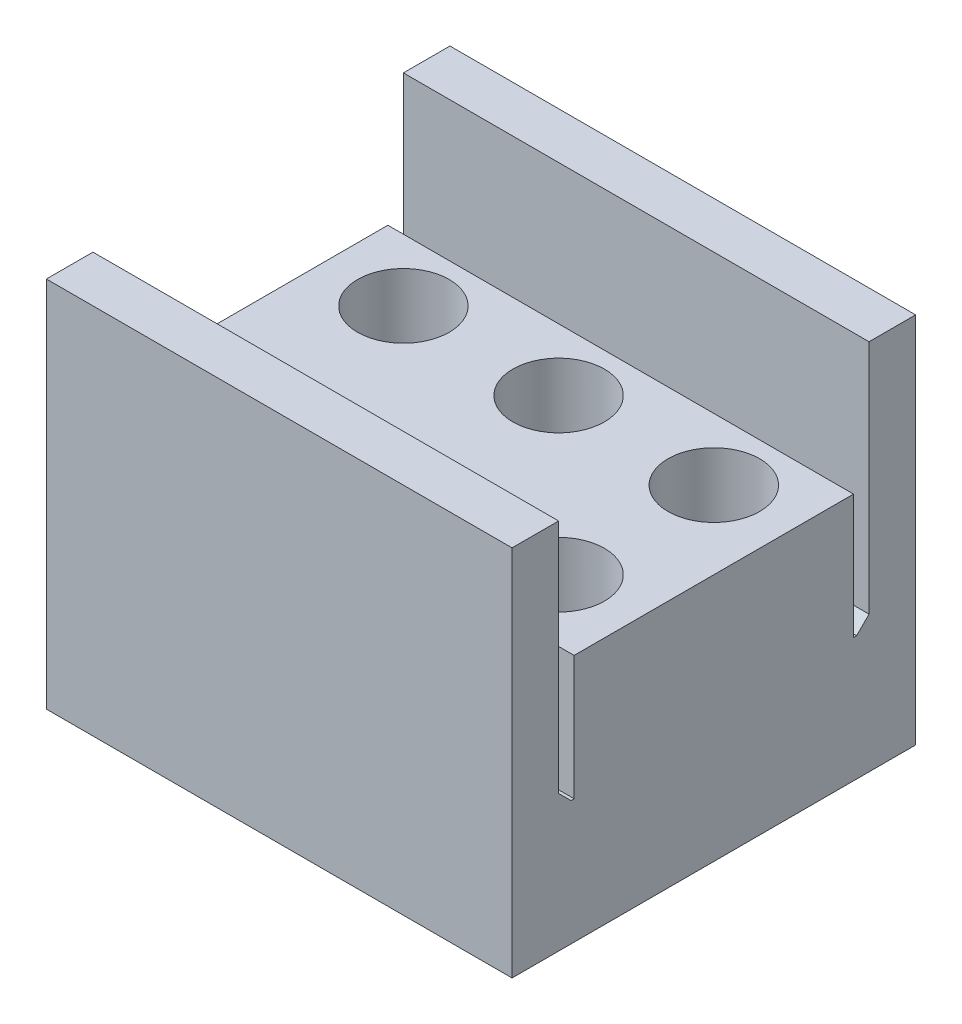
ISO-10303-21;
HEADER;
FILE_DESCRIPTION(('STEP AP214'),'2;1');
FILE_NAME('part.step','',(''),(''),'','','');
FILE_SCHEMA(('AUTOMOTIVE_DESIGN { 1 0 10303 214 1 1 1 1 }'));
ENDSEC;
DATA;
#1=APPLICATION_CONTEXT('core data for automotive mechanical design processes');
#2=APPLICATION_PROTOCOL_DEFINITION('international standard','automotive_design',2000,#1);
#3=PRODUCT_CONTEXT('',#1,'mechanical');
#4=PRODUCT('Part','Part','',(#3));
#5=PRODUCT_RELATED_PRODUCT_CATEGORY('part','',(#4));
#6=PRODUCT_DEFINITION_FORMATION('','',#4);
#7=PRODUCT_DEFINITION_CONTEXT('part definition',#1,'design');
#8=PRODUCT_DEFINITION('design','',#6,#7);
#9=PRODUCT_DEFINITION_SHAPE('','',#8);
#10=(LENGTH_UNIT() NAMED_UNIT(*) SI_UNIT(.MILLI.,.METRE.));
#11=(NAMED_UNIT(*) PLANE_ANGLE_UNIT() SI_UNIT($,.RADIAN.));
#12=(NAMED_UNIT(*) SI_UNIT($,.STERADIAN.) SOLID_ANGLE_UNIT());
#13=UNCERTAINTY_MEASURE_WITH_UNIT(LENGTH_MEASURE(1.E-05),#10,'distance_accuracy_value','');
#14=(GEOMETRIC_REPRESENTATION_CONTEXT(3) GLOBAL_UNCERTAINTY_ASSIGNED_CONTEXT((#13)) GLOBAL_UNIT_ASSIGNED_CONTEXT((#10,
#11,#12)) REPRESENTATION_CONTEXT('',''));
#15=CARTESIAN_POINT('',(0.,0.,0.));
#16=DIRECTION('',(0.,0.,1.));
#17=DIRECTION('',(1.,0.,0.));
#18=AXIS2_PLACEMENT_3D('',#15,#16,#17);
#19=CARTESIAN_POINT('',(5.,12.1719300090006,-2.5));
#20=DIRECTION('',(0.,-1.,0.));
#21=DIRECTION('',(0.,0.,-1.));
#22=AXIS2_PLACEMENT_3D('',#19,#20,#21);
#23=CYLINDRICAL_SURFACE('',#22,1.475);
#24=CARTESIAN_POINT('',(5.,0.,-2.5));
#25=DIRECTION('',(0.,-1.,0.));
#26=DIRECTION('',(0.,0.,-1.));
#27=AXIS2_PLACEMENT_3D('',#24,#25,#26);
#28=CIRCLE('',#27,1.475);
#29=CARTESIAN_POINT('',(5.,0.,-3.975));
#30=VERTEX_POINT('',#29);
#31=EDGE_CURVE('E49',#30,#30,#28,.T.);
#32=ORIENTED_EDGE('',*,*,#31,.T.);
#33=EDGE_LOOP('',(#32));
#34=FACE_BOUND('',#33,.T.);
#35=CARTESIAN_POINT('',(5.,8.,-2.5));
#36=DIRECTION('',(0.,1.,0.));
#37=DIRECTION('',(0.,0.,1.));
#38=AXIS2_PLACEMENT_3D('',#35,#36,#37);
#39=CIRCLE('',#38,1.475);
#40=CARTESIAN_POINT('',(5.,8.,-1.025));
#41=VERTEX_POINT('',#40);
#42=EDGE_CURVE('E11',#41,#41,#39,.F.);
#43=ORIENTED_EDGE('',*,*,#42,.F.);
#44=EDGE_LOOP('',(#43));
#45=FACE_BOUND('',#44,.T.);
#46=ADVANCED_FACE('F43',(#34,#45),#23,.F.);
#47=CARTESIAN_POINT('',(0.,12.1719300090006,-2.5));
#48=DIRECTION('',(0.,-1.,0.));
#49=DIRECTION('',(0.,0.,-1.));
#50=AXIS2_PLACEMENT_3D('',#47,#48,#49);
#51=CYLINDRICAL_SURFACE('',#50,1.475);
#52=CARTESIAN_POINT('',(0.,0.,-2.5));
#53=DIRECTION('',(0.,-1.,0.));
#54=DIRECTION('',(0.,0.,-1.));
#55=AXIS2_PLACEMENT_3D('',#52,#53,#54);
#56=CIRCLE('',#55,1.475);
#57=CARTESIAN_POINT('',(0.,0.,-3.975));
#58=VERTEX_POINT('',#57);
#59=EDGE_CURVE('E266',#58,#58,#56,.T.);
#60=ORIENTED_EDGE('',*,*,#59,.T.);
#61=EDGE_LOOP('',(#60));
#62=FACE_BOUND('',#61,.T.);
#63=CARTESIAN_POINT('',(0.,8.,-2.5));
#64=DIRECTION('',(0.,1.,0.));
#65=DIRECTION('',(0.,0.,1.));
#66=AXIS2_PLACEMENT_3D('',#63,#64,#65);
#67=CIRCLE('',#66,1.475);
#68=CARTESIAN_POINT('',(0.,8.,-1.025));
#69=VERTEX_POINT('',#68);
#70=EDGE_CURVE('E271',#69,#69,#67,.F.);
#71=ORIENTED_EDGE('',*,*,#70,.F.);
#72=EDGE_LOOP('',(#71));
#73=FACE_BOUND('',#72,.T.);
#74=ADVANCED_FACE('F301',(#62,#73),#51,.F.);
#75=CARTESIAN_POINT('',(-5.,12.1719300090006,-2.5));
#76=DIRECTION('',(0.,-1.,0.));
#77=DIRECTION('',(0.,0.,-1.));
#78=AXIS2_PLACEMENT_3D('',#75,#76,#77);
#79=CYLINDRICAL_SURFACE('',#78,1.475);
#80=CARTESIAN_POINT('',(-5.,0.,-2.5));
#81=DIRECTION('',(0.,-1.,0.));
#82=DIRECTION('',(0.,0.,-1.));
#83=AXIS2_PLACEMENT_3D('',#80,#81,#82);
#84=CIRCLE('',#83,1.475);
#85=CARTESIAN_POINT('',(-5.,0.,-3.975));
#86=VERTEX_POINT('',#85);
#87=EDGE_CURVE('E263',#86,#86,#84,.T.);
#88=ORIENTED_EDGE('',*,*,#87,.T.);
#89=EDGE_LOOP('',(#88));
#90=FACE_BOUND('',#89,.T.);
#91=CARTESIAN_POINT('',(-5.,8.,-2.5));
#92=DIRECTION('',(0.,1.,0.));
#93=DIRECTION('',(0.,0.,1.));
#94=AXIS2_PLACEMENT_3D('',#91,#92,#93);
#95=CIRCLE('',#94,1.475);
#96=CARTESIAN_POINT('',(-5.,8.,-1.025));
#97=VERTEX_POINT('',#96);
#98=EDGE_CURVE('E269',#97,#97,#95,.F.);
#99=ORIENTED_EDGE('',*,*,#98,.F.);
#100=EDGE_LOOP('',(#99));
#101=FACE_BOUND('',#100,.T.);
#102=ADVANCED_FACE('F306',(#90,#101),#79,.F.);
#103=CARTESIAN_POINT('',(5.,12.1719300090006,2.5));
#104=DIRECTION('',(0.,-1.,0.));
#105=DIRECTION('',(0.,0.,-1.));
#106=AXIS2_PLACEMENT_3D('',#103,#104,#105);
#107=CYLINDRICAL_SURFACE('',#106,1.475);
#108=CARTESIAN_POINT('',(5.,0.,2.5));
#109=DIRECTION('',(0.,-1.,0.));
#110=DIRECTION('',(0.,0.,-1.));
#111=AXIS2_PLACEMENT_3D('',#108,#109,#110);
#112=CIRCLE('',#111,1.475);
#113=CARTESIAN_POINT('',(5.,0.,1.025));
#114=VERTEX_POINT('',#113);
#115=EDGE_CURVE('E257',#114,#114,#112,.T.);
#116=ORIENTED_EDGE('',*,*,#115,.T.);
#117=EDGE_LOOP('',(#116));
#118=FACE_BOUND('',#117,.T.);
#119=CARTESIAN_POINT('',(5.,8.,2.5));
#120=DIRECTION('',(0.,1.,0.));
#121=DIRECTION('',(0.,0.,1.));
#122=AXIS2_PLACEMENT_3D('',#119,#120,#121);
#123=CIRCLE('',#122,1.475);
#124=CARTESIAN_POINT('',(5.,8.,3.975));
#125=VERTEX_POINT('',#124);
#126=EDGE_CURVE('E261',#125,#125,#123,.F.);
#127=ORIENTED_EDGE('',*,*,#126,.F.);
#128=EDGE_LOOP('',(#127));
#129=FACE_BOUND('',#128,.T.);
#130=ADVANCED_FACE('F311',(#118,#129),#107,.F.);
#131=CARTESIAN_POINT('',(7.5,8.,-6.5));
#132=DIRECTION('',(-1.,0.,0.));
#133=DIRECTION('',(0.,0.,1.));
#134=AXIS2_PLACEMENT_3D('',#131,#132,#133);
#135=PLANE('',#134);
#136=DIRECTION('',(0.,0.,-1.));
#137=VECTOR('',#136,1.);
#138=CARTESIAN_POINT('',(7.5,4.,-5.));
#139=LINE('',#138,#137);
#140=CARTESIAN_POINT('',(7.5,4.,-4.5));
#141=VERTEX_POINT('',#140);
#142=CARTESIAN_POINT('',(7.5,4.,-4.6));
#143=VERTEX_POINT('',#142);
#144=EDGE_CURVE('E162',#141,#143,#139,.T.);
#145=ORIENTED_EDGE('',*,*,#144,.F.);
#146=DIRECTION('',(0.,1.,0.));
#147=VECTOR('',#146,1.);
#148=CARTESIAN_POINT('',(7.5,4.,-4.5));
#149=LINE('',#148,#147);
#150=CARTESIAN_POINT('',(7.5,8.,-4.5));
#151=VERTEX_POINT('',#150);
#152=EDGE_CURVE('E163',#141,#151,#149,.T.);
#153=ORIENTED_EDGE('',*,*,#152,.T.);
#154=DIRECTION('',(0.,0.,-1.));
#155=VECTOR('',#154,1.);
#156=CARTESIAN_POINT('',(7.5,8.,-6.5));
#157=LINE('',#156,#155);
#158=CARTESIAN_POINT('',(7.5,8.,4.5));
#159=VERTEX_POINT('',#158);
#160=EDGE_CURVE('E219',#159,#151,#157,.T.);
#161=ORIENTED_EDGE('',*,*,#160,.F.);
#162=DIRECTION('',(0.,1.,0.));
#163=VECTOR('',#162,1.);
#164=CARTESIAN_POINT('',(7.5,4.,4.5));
#165=LINE('',#164,#163);
#166=CARTESIAN_POINT('',(7.5,4.,4.5));
#167=VERTEX_POINT('',#166);
#168=EDGE_CURVE('E174',#167,#159,#165,.T.);
#169=ORIENTED_EDGE('',*,*,#168,.F.);
#170=DIRECTION('',(0.,0.,-1.));
#171=VECTOR('',#170,1.);
#172=CARTESIAN_POINT('',(7.5,4.,5.));
#173=LINE('',#172,#171);
#174=CARTESIAN_POINT('',(7.5,4.,4.6));
#175=VERTEX_POINT('',#174);
#176=EDGE_CURVE('E184',#175,#167,#173,.T.);
#177=ORIENTED_EDGE('',*,*,#176,.F.);
#178=DIRECTION('',(0.,-0.707106781186544,-0.707106781186551));
#179=VECTOR('',#178,1.);
#180=CARTESIAN_POINT('',(7.5,0.449999999999985,1.04999999999995));
#181=LINE('',#180,#179);
#182=CARTESIAN_POINT('',(7.5,4.4,5.));
#183=VERTEX_POINT('',#182);
#184=EDGE_CURVE('E252',#175,#183,#181,.F.);
#185=ORIENTED_EDGE('',*,*,#184,.T.);
#186=DIRECTION('',(0.,-1.,0.));
#187=VECTOR('',#186,1.);
#188=CARTESIAN_POINT('',(7.5,12.,5.));
#189=LINE('',#188,#187);
#190=CARTESIAN_POINT('',(7.5,12.,5.));
#191=VERTEX_POINT('',#190);
#192=EDGE_CURVE('E167',#191,#183,#189,.T.);
#193=ORIENTED_EDGE('',*,*,#192,.F.);
#194=DIRECTION('',(0.,0.,-1.));
#195=VECTOR('',#194,1.);
#196=CARTESIAN_POINT('',(7.5,12.,6.5));
#197=LINE('',#196,#195);
#198=CARTESIAN_POINT('',(7.5,12.,6.5));
#199=VERTEX_POINT('',#198);
#200=EDGE_CURVE('E212',#199,#191,#197,.T.);
#201=ORIENTED_EDGE('',*,*,#200,.F.);
#202=DIRECTION('',(0.,-1.,0.));
#203=VECTOR('',#202,1.);
#204=CARTESIAN_POINT('',(7.5,8.,6.5));
#205=LINE('',#204,#203);
#206=CARTESIAN_POINT('',(7.5,0.,6.5));
#207=VERTEX_POINT('',#206);
#208=EDGE_CURVE('E221',#199,#207,#205,.T.);
#209=ORIENTED_EDGE('',*,*,#208,.T.);
#210=DIRECTION('',(0.,0.,-1.));
#211=VECTOR('',#210,1.);
#212=CARTESIAN_POINT('',(7.5,0.,-6.5));
#213=LINE('',#212,#211);
#214=CARTESIAN_POINT('',(7.5,0.,-6.5));
#215=VERTEX_POINT('',#214);
#216=EDGE_CURVE('E201',#207,#215,#213,.T.);
#217=ORIENTED_EDGE('',*,*,#216,.T.);
#218=DIRECTION('',(0.,-1.,0.));
#219=VECTOR('',#218,1.);
#220=CARTESIAN_POINT('',(7.5,8.,-6.5));
#221=LINE('',#220,#219);
#222=CARTESIAN_POINT('',(7.5,12.,-6.5));
#223=VERTEX_POINT('',#222);
#224=EDGE_CURVE('E241',#223,#215,#221,.T.);
#225=ORIENTED_EDGE('',*,*,#224,.F.);
#226=DIRECTION('',(0.,0.,-1.));
#227=VECTOR('',#226,1.);
#228=CARTESIAN_POINT('',(7.5,12.,-6.5));
#229=LINE('',#228,#227);
#230=CARTESIAN_POINT('',(7.5,12.,-5.));
#231=VERTEX_POINT('',#230);
#232=EDGE_CURVE('E194',#231,#223,#229,.T.);
#233=ORIENTED_EDGE('',*,*,#232,.F.);
#234=DIRECTION('',(0.,-1.,0.));
#235=VECTOR('',#234,1.);
#236=CARTESIAN_POINT('',(7.5,12.,-5.));
#237=LINE('',#236,#235);
#238=CARTESIAN_POINT('',(7.5,4.4,-5.));
#239=VERTEX_POINT('',#238);
#240=EDGE_CURVE('E203',#231,#239,#237,.T.);
#241=ORIENTED_EDGE('',*,*,#240,.T.);
#242=DIRECTION('',(0.,-0.707106781186546,0.707106781186549));
#243=VECTOR('',#242,1.);
#244=CARTESIAN_POINT('',(7.5,6.94999999999999,-7.55));
#245=LINE('',#244,#243);
#246=EDGE_CURVE('E256',#239,#143,#245,.T.);
#247=ORIENTED_EDGE('',*,*,#246,.T.);
#248=EDGE_LOOP('',(#145,#153,#161,#169,#177,#185,#193,#201,#209,#217,#225,#233,#241,#247));
#249=FACE_BOUND('',#248,.T.);
#250=ADVANCED_FACE('F319',(#249),#135,.F.);
#251=CARTESIAN_POINT('',(-7.5,8.,-6.5));
#252=DIRECTION('',(0.,0.,1.));
#253=DIRECTION('',(1.,0.,0.));
#254=AXIS2_PLACEMENT_3D('',#251,#252,#253);
#255=PLANE('',#254);
#256=DIRECTION('',(-1.,0.,0.));
#257=VECTOR('',#256,1.);
#258=CARTESIAN_POINT('',(-7.5,0.,-6.5));
#259=LINE('',#258,#257);
#260=CARTESIAN_POINT('',(-7.5,0.,-6.5));
#261=VERTEX_POINT('',#260);
#262=EDGE_CURVE('E226',#215,#261,#259,.T.);
#263=ORIENTED_EDGE('',*,*,#262,.T.);
#264=DIRECTION('',(0.,-1.,0.));
#265=VECTOR('',#264,1.);
#266=CARTESIAN_POINT('',(-7.5,8.,-6.5));
#267=LINE('',#266,#265);
#268=CARTESIAN_POINT('',(-7.5,12.,-6.5));
#269=VERTEX_POINT('',#268);
#270=EDGE_CURVE('E238',#269,#261,#267,.T.);
#271=ORIENTED_EDGE('',*,*,#270,.F.);
#272=DIRECTION('',(-1.,0.,0.));
#273=VECTOR('',#272,1.);
#274=CARTESIAN_POINT('',(-7.5,12.,-6.5));
#275=LINE('',#274,#273);
#276=EDGE_CURVE('E197',#223,#269,#275,.T.);
#277=ORIENTED_EDGE('',*,*,#276,.F.);
#278=ORIENTED_EDGE('',*,*,#224,.T.);
#279=EDGE_LOOP('',(#263,#271,#277,#278));
#280=FACE_BOUND('',#279,.T.);
#281=ADVANCED_FACE('F340',(#280),#255,.F.);
#282=CARTESIAN_POINT('',(-7.5,8.,-6.5));
#283=DIRECTION('',(1.,0.,0.));
#284=DIRECTION('',(0.,0.,-1.));
#285=AXIS2_PLACEMENT_3D('',#282,#283,#284);
#286=PLANE('',#285);
#287=DIRECTION('',(0.,0.,1.));
#288=VECTOR('',#287,1.);
#289=CARTESIAN_POINT('',(-7.5,4.,-5.));
#290=LINE('',#289,#288);
#291=CARTESIAN_POINT('',(-7.5,4.,-4.6));
#292=VERTEX_POINT('',#291);
#293=CARTESIAN_POINT('',(-7.5,4.,-4.5));
#294=VERTEX_POINT('',#293);
#295=EDGE_CURVE('E143',#292,#294,#290,.T.);
#296=ORIENTED_EDGE('',*,*,#295,.F.);
#297=DIRECTION('',(0.,0.707106781186546,-0.707106781186549));
#298=VECTOR('',#297,1.);
#299=CARTESIAN_POINT('',(-7.5,6.94999999999999,-7.55));
#300=LINE('',#299,#298);
#301=CARTESIAN_POINT('',(-7.5,4.4,-5.));
#302=VERTEX_POINT('',#301);
#303=EDGE_CURVE('E64',#292,#302,#300,.T.);
#304=ORIENTED_EDGE('',*,*,#303,.T.);
#305=DIRECTION('',(0.,-1.,0.));
#306=VECTOR('',#305,1.);
#307=CARTESIAN_POINT('',(-7.5,12.,-5.));
#308=LINE('',#307,#306);
#309=CARTESIAN_POINT('',(-7.5,12.,-5.));
#310=VERTEX_POINT('',#309);
#311=EDGE_CURVE('E202',#310,#302,#308,.T.);
#312=ORIENTED_EDGE('',*,*,#311,.F.);
#313=DIRECTION('',(0.,0.,1.));
#314=VECTOR('',#313,1.);
#315=CARTESIAN_POINT('',(-7.5,12.,-6.5));
#316=LINE('',#315,#314);
#317=EDGE_CURVE('E186',#269,#310,#316,.T.);
#318=ORIENTED_EDGE('',*,*,#317,.F.);
#319=ORIENTED_EDGE('',*,*,#270,.T.);
#320=DIRECTION('',(0.,0.,1.));
#321=VECTOR('',#320,1.);
#322=CARTESIAN_POINT('',(-7.5,0.,-6.5));
#323=LINE('',#322,#321);
#324=CARTESIAN_POINT('',(-7.5,0.,6.5));
#325=VERTEX_POINT('',#324);
#326=EDGE_CURVE('E229',#261,#325,#323,.T.);
#327=ORIENTED_EDGE('',*,*,#326,.T.);
#328=DIRECTION('',(0.,-1.,0.));
#329=VECTOR('',#328,1.);
#330=CARTESIAN_POINT('',(-7.5,8.,6.5));
#331=LINE('',#330,#329);
#332=CARTESIAN_POINT('',(-7.5,12.,6.5));
#333=VERTEX_POINT('',#332);
#334=EDGE_CURVE('E232',#333,#325,#331,.T.);
#335=ORIENTED_EDGE('',*,*,#334,.F.);
#336=DIRECTION('',(0.,0.,1.));
#337=VECTOR('',#336,1.);
#338=CARTESIAN_POINT('',(-7.5,12.,6.5));
#339=LINE('',#338,#337);
#340=CARTESIAN_POINT('',(-7.5,12.,5.));
#341=VERTEX_POINT('',#340);
#342=EDGE_CURVE('E192',#341,#333,#339,.T.);
#343=ORIENTED_EDGE('',*,*,#342,.F.);
#344=DIRECTION('',(0.,-1.,0.));
#345=VECTOR('',#344,1.);
#346=CARTESIAN_POINT('',(-7.5,12.,5.));
#347=LINE('',#346,#345);
#348=CARTESIAN_POINT('',(-7.5,4.4,5.));
#349=VERTEX_POINT('',#348);
#350=EDGE_CURVE('E206',#341,#349,#347,.T.);
#351=ORIENTED_EDGE('',*,*,#350,.T.);
#352=DIRECTION('',(0.,0.707106781186544,0.707106781186551));
#353=VECTOR('',#352,1.);
#354=CARTESIAN_POINT('',(-7.5,0.449999999999985,1.04999999999995));
#355=LINE('',#354,#353);
#356=CARTESIAN_POINT('',(-7.5,4.,4.6));
#357=VERTEX_POINT('',#356);
#358=EDGE_CURVE('E254',#349,#357,#355,.F.);
#359=ORIENTED_EDGE('',*,*,#358,.T.);
#360=DIRECTION('',(0.,0.,1.));
#361=VECTOR('',#360,1.);
#362=CARTESIAN_POINT('',(-7.5,4.,5.));
#363=LINE('',#362,#361);
#364=CARTESIAN_POINT('',(-7.5,4.,4.5));
#365=VERTEX_POINT('',#364);
#366=EDGE_CURVE('E182',#365,#357,#363,.T.);
#367=ORIENTED_EDGE('',*,*,#366,.F.);
#368=DIRECTION('',(0.,1.,0.));
#369=VECTOR('',#368,1.);
#370=CARTESIAN_POINT('',(-7.5,4.,4.5));
#371=LINE('',#370,#369);
#372=CARTESIAN_POINT('',(-7.5,8.,4.5));
#373=VERTEX_POINT('',#372);
#374=EDGE_CURVE('E178',#365,#373,#371,.T.);
#375=ORIENTED_EDGE('',*,*,#374,.T.);
#376=DIRECTION('',(0.,0.,1.));
#377=VECTOR('',#376,1.);
#378=CARTESIAN_POINT('',(-7.5,8.,-6.5));
#379=LINE('',#378,#377);
#380=CARTESIAN_POINT('',(-7.5,8.,-4.5));
#381=VERTEX_POINT('',#380);
#382=EDGE_CURVE('E166',#381,#373,#379,.T.);
#383=ORIENTED_EDGE('',*,*,#382,.F.);
#384=DIRECTION('',(0.,1.,0.));
#385=VECTOR('',#384,1.);
#386=CARTESIAN_POINT('',(-7.5,4.,-4.5));
#387=LINE('',#386,#385);
#388=EDGE_CURVE('E157',#294,#381,#387,.T.);
#389=ORIENTED_EDGE('',*,*,#388,.F.);
#390=EDGE_LOOP('',(#296,#304,#312,#318,#319,#327,#335,#343,#351,#359,#367,#375,#383,#389));
#391=FACE_BOUND('',#390,.T.);
#392=ADVANCED_FACE('F164',(#391),#286,.F.);
#393=CARTESIAN_POINT('',(-7.5,8.,6.5));
#394=DIRECTION('',(0.,0.,-1.));
#395=DIRECTION('',(-1.,0.,0.));
#396=AXIS2_PLACEMENT_3D('',#393,#394,#395);
#397=PLANE('',#396);
#398=DIRECTION('',(1.,0.,0.));
#399=VECTOR('',#398,1.);
#400=CARTESIAN_POINT('',(-7.5,0.,6.5));
#401=LINE('',#400,#399);
#402=EDGE_CURVE('E222',#325,#207,#401,.T.);
#403=ORIENTED_EDGE('',*,*,#402,.T.);
#404=ORIENTED_EDGE('',*,*,#208,.F.);
#405=DIRECTION('',(1.,0.,0.));
#406=VECTOR('',#405,1.);
#407=CARTESIAN_POINT('',(-7.5,12.,6.5));
#408=LINE('',#407,#406);
#409=EDGE_CURVE('E214',#333,#199,#408,.T.);
#410=ORIENTED_EDGE('',*,*,#409,.F.);
#411=ORIENTED_EDGE('',*,*,#334,.T.);
#412=EDGE_LOOP('',(#403,#404,#410,#411));
#413=FACE_BOUND('',#412,.T.);
#414=ADVANCED_FACE('F295',(#413),#397,.F.);
#415=CARTESIAN_POINT('',(0.,8.,0.));
#416=DIRECTION('',(0.,1.,0.));
#417=DIRECTION('',(0.,0.,1.));
#418=AXIS2_PLACEMENT_3D('',#415,#416,#417);
#419=PLANE('',#418);
#420=CARTESIAN_POINT('',(0.,8.,2.5));
#421=DIRECTION('',(0.,1.,0.));
#422=DIRECTION('',(0.,0.,1.));
#423=AXIS2_PLACEMENT_3D('',#420,#421,#422);
#424=CIRCLE('',#423,1.475);
#425=CARTESIAN_POINT('',(0.,8.,3.975));
#426=VERTEX_POINT('',#425);
#427=EDGE_CURVE('E409',#426,#426,#424,.F.);
#428=ORIENTED_EDGE('',*,*,#427,.T.);
#429=EDGE_LOOP('',(#428));
#430=FACE_BOUND('',#429,.T.);
#431=CARTESIAN_POINT('',(-5.,8.,2.5));
#432=DIRECTION('',(0.,1.,0.));
#433=DIRECTION('',(0.,0.,1.));
#434=AXIS2_PLACEMENT_3D('',#431,#432,#433);
#435=CIRCLE('',#434,1.475);
#436=CARTESIAN_POINT('',(-5.,8.,3.975));
#437=VERTEX_POINT('',#436);
#438=EDGE_CURVE('E179',#437,#437,#435,.F.);
#439=ORIENTED_EDGE('',*,*,#438,.T.);
#440=EDGE_LOOP('',(#439));
#441=FACE_BOUND('',#440,.T.);
#442=DIRECTION('',(1.,0.,0.));
#443=VECTOR('',#442,1.);
#444=CARTESIAN_POINT('',(-7.5,8.,-4.5));
#445=LINE('',#444,#443);
#446=EDGE_CURVE('E153',#381,#151,#445,.T.);
#447=ORIENTED_EDGE('',*,*,#446,.F.);
#448=ORIENTED_EDGE('',*,*,#382,.T.);
#449=DIRECTION('',(-1.,0.,0.));
#450=VECTOR('',#449,1.);
#451=CARTESIAN_POINT('',(-7.5,8.,4.5));
#452=LINE('',#451,#450);
#453=EDGE_CURVE('E181',#159,#373,#452,.T.);
#454=ORIENTED_EDGE('',*,*,#453,.F.);
#455=ORIENTED_EDGE('',*,*,#160,.T.);
#456=EDGE_LOOP('',(#447,#448,#454,#455));
#457=FACE_BOUND('',#456,.T.);
#458=ORIENTED_EDGE('',*,*,#126,.T.);
#459=EDGE_LOOP('',(#458));
#460=FACE_BOUND('',#459,.T.);
#461=ORIENTED_EDGE('',*,*,#98,.T.);
#462=EDGE_LOOP('',(#461));
#463=FACE_BOUND('',#462,.T.);
#464=ORIENTED_EDGE('',*,*,#70,.T.);
#465=EDGE_LOOP('',(#464));
#466=FACE_BOUND('',#465,.T.);
#467=ORIENTED_EDGE('',*,*,#42,.T.);
#468=EDGE_LOOP('',(#467));
#469=FACE_BOUND('',#468,.T.);
#470=ADVANCED_FACE('F282',(#430,#441,#457,#460,#463,#466,#469),#419,.T.);
#471=CARTESIAN_POINT('',(0.,0.,0.));
#472=DIRECTION('',(0.,1.,0.));
#473=DIRECTION('',(0.,0.,1.));
#474=AXIS2_PLACEMENT_3D('',#471,#472,#473);
#475=PLANE('',#474);
#476=CARTESIAN_POINT('',(0.,0.,2.5));
#477=DIRECTION('',(0.,-1.,0.));
#478=DIRECTION('',(0.,0.,-1.));
#479=AXIS2_PLACEMENT_3D('',#476,#477,#478);
#480=CIRCLE('',#479,1.475);
#481=CARTESIAN_POINT('',(0.,0.,1.025));
#482=VERTEX_POINT('',#481);
#483=EDGE_CURVE('E410',#482,#482,#480,.T.);
#484=ORIENTED_EDGE('',*,*,#483,.F.);
#485=EDGE_LOOP('',(#484));
#486=FACE_BOUND('',#485,.T.);
#487=CARTESIAN_POINT('',(-5.,0.,2.5));
#488=DIRECTION('',(0.,-1.,0.));
#489=DIRECTION('',(0.,0.,-1.));
#490=AXIS2_PLACEMENT_3D('',#487,#488,#489);
#491=CIRCLE('',#490,1.475);
#492=CARTESIAN_POINT('',(-5.,0.,1.025));
#493=VERTEX_POINT('',#492);
#494=EDGE_CURVE('E411',#493,#493,#491,.T.);
#495=ORIENTED_EDGE('',*,*,#494,.F.);
#496=EDGE_LOOP('',(#495));
#497=FACE_BOUND('',#496,.T.);
#498=ORIENTED_EDGE('',*,*,#216,.F.);
#499=ORIENTED_EDGE('',*,*,#402,.F.);
#500=ORIENTED_EDGE('',*,*,#326,.F.);
#501=ORIENTED_EDGE('',*,*,#262,.F.);
#502=EDGE_LOOP('',(#498,#499,#500,#501));
#503=FACE_BOUND('',#502,.T.);
#504=ORIENTED_EDGE('',*,*,#115,.F.);
#505=EDGE_LOOP('',(#504));
#506=FACE_BOUND('',#505,.T.);
#507=ORIENTED_EDGE('',*,*,#87,.F.);
#508=EDGE_LOOP('',(#507));
#509=FACE_BOUND('',#508,.T.);
#510=ORIENTED_EDGE('',*,*,#59,.F.);
#511=EDGE_LOOP('',(#510));
#512=FACE_BOUND('',#511,.T.);
#513=ORIENTED_EDGE('',*,*,#31,.F.);
#514=EDGE_LOOP('',(#513));
#515=FACE_BOUND('',#514,.T.);
#516=ADVANCED_FACE('F279',(#486,#497,#503,#506,#509,#512,#515),#475,.F.);
#517=CARTESIAN_POINT('',(-7.5,12.,5.));
#518=DIRECTION('',(0.,0.,1.));
#519=DIRECTION('',(1.,0.,0.));
#520=AXIS2_PLACEMENT_3D('',#517,#518,#519);
#521=PLANE('',#520);
#522=ORIENTED_EDGE('',*,*,#192,.T.);
#523=DIRECTION('',(-1.,0.,0.));
#524=VECTOR('',#523,1.);
#525=CARTESIAN_POINT('',(-7.5,4.4,5.));
#526=LINE('',#525,#524);
#527=EDGE_CURVE('E250',#183,#349,#526,.T.);
#528=ORIENTED_EDGE('',*,*,#527,.T.);
#529=ORIENTED_EDGE('',*,*,#350,.F.);
#530=DIRECTION('',(-1.,0.,0.));
#531=VECTOR('',#530,1.);
#532=CARTESIAN_POINT('',(-7.5,12.,5.));
#533=LINE('',#532,#531);
#534=EDGE_CURVE('E211',#191,#341,#533,.T.);
#535=ORIENTED_EDGE('',*,*,#534,.F.);
#536=EDGE_LOOP('',(#522,#528,#529,#535));
#537=FACE_BOUND('',#536,.T.);
#538=ADVANCED_FACE('F285',(#537),#521,.F.);
#539=CARTESIAN_POINT('',(0.,12.,0.));
#540=DIRECTION('',(0.,-1.,0.));
#541=DIRECTION('',(0.,0.,-1.));
#542=AXIS2_PLACEMENT_3D('',#539,#540,#541);
#543=PLANE('',#542);
#544=ORIENTED_EDGE('',*,*,#342,.T.);
#545=ORIENTED_EDGE('',*,*,#409,.T.);
#546=ORIENTED_EDGE('',*,*,#200,.T.);
#547=ORIENTED_EDGE('',*,*,#534,.T.);
#548=EDGE_LOOP('',(#544,#545,#546,#547));
#549=FACE_BOUND('',#548,.T.);
#550=ADVANCED_FACE('F293',(#549),#543,.F.);
#551=CARTESIAN_POINT('',(-7.5,12.,-5.));
#552=DIRECTION('',(0.,0.,-1.));
#553=DIRECTION('',(-1.,0.,0.));
#554=AXIS2_PLACEMENT_3D('',#551,#552,#553);
#555=PLANE('',#554);
#556=ORIENTED_EDGE('',*,*,#311,.T.);
#557=DIRECTION('',(1.,0.,0.));
#558=VECTOR('',#557,1.);
#559=CARTESIAN_POINT('',(-7.5,4.4,-5.));
#560=LINE('',#559,#558);
#561=EDGE_CURVE('E60',#302,#239,#560,.T.);
#562=ORIENTED_EDGE('',*,*,#561,.T.);
#563=ORIENTED_EDGE('',*,*,#240,.F.);
#564=DIRECTION('',(1.,0.,0.));
#565=VECTOR('',#564,1.);
#566=CARTESIAN_POINT('',(-7.5,12.,-5.));
#567=LINE('',#566,#565);
#568=EDGE_CURVE('E195',#310,#231,#567,.T.);
#569=ORIENTED_EDGE('',*,*,#568,.F.);
#570=EDGE_LOOP('',(#556,#562,#563,#569));
#571=FACE_BOUND('',#570,.T.);
#572=ADVANCED_FACE('F363',(#571),#555,.F.);
#573=CARTESIAN_POINT('',(0.,12.,0.));
#574=DIRECTION('',(0.,1.,0.));
#575=DIRECTION('',(0.,0.,1.));
#576=AXIS2_PLACEMENT_3D('',#573,#574,#575);
#577=PLANE('',#576);
#578=ORIENTED_EDGE('',*,*,#317,.T.);
#579=ORIENTED_EDGE('',*,*,#568,.T.);
#580=ORIENTED_EDGE('',*,*,#232,.T.);
#581=ORIENTED_EDGE('',*,*,#276,.T.);
#582=EDGE_LOOP('',(#578,#579,#580,#581));
#583=FACE_BOUND('',#582,.T.);
#584=ADVANCED_FACE('F360',(#583),#577,.T.);
#585=CARTESIAN_POINT('',(-7.5,4.,4.5));
#586=DIRECTION('',(0.,0.,-1.));
#587=DIRECTION('',(-1.,0.,0.));
#588=AXIS2_PLACEMENT_3D('',#585,#586,#587);
#589=PLANE('',#588);
#590=ORIENTED_EDGE('',*,*,#453,.T.);
#591=ORIENTED_EDGE('',*,*,#374,.F.);
#592=DIRECTION('',(-1.,0.,0.));
#593=VECTOR('',#592,1.);
#594=CARTESIAN_POINT('',(-7.5,4.,4.5));
#595=LINE('',#594,#593);
#596=EDGE_CURVE('E180',#167,#365,#595,.T.);
#597=ORIENTED_EDGE('',*,*,#596,.F.);
#598=ORIENTED_EDGE('',*,*,#168,.T.);
#599=EDGE_LOOP('',(#590,#591,#597,#598));
#600=FACE_BOUND('',#599,.T.);
#601=ADVANCED_FACE('F369',(#600),#589,.F.);
#602=CARTESIAN_POINT('',(0.,4.,0.));
#603=DIRECTION('',(0.,-1.,0.));
#604=DIRECTION('',(0.,0.,-1.));
#605=AXIS2_PLACEMENT_3D('',#602,#603,#604);
#606=PLANE('',#605);
#607=ORIENTED_EDGE('',*,*,#366,.T.);
#608=DIRECTION('',(1.,0.,0.));
#609=VECTOR('',#608,1.);
#610=CARTESIAN_POINT('',(7.5,4.,4.6));
#611=LINE('',#610,#609);
#612=EDGE_CURVE('E242',#357,#175,#611,.T.);
#613=ORIENTED_EDGE('',*,*,#612,.T.);
#614=ORIENTED_EDGE('',*,*,#176,.T.);
#615=ORIENTED_EDGE('',*,*,#596,.T.);
#616=EDGE_LOOP('',(#607,#613,#614,#615));
#617=FACE_BOUND('',#616,.T.);
#618=ADVANCED_FACE('F376',(#617),#606,.F.);
#619=CARTESIAN_POINT('',(-7.5,4.,-4.5));
#620=DIRECTION('',(0.,0.,1.));
#621=DIRECTION('',(1.,0.,0.));
#622=AXIS2_PLACEMENT_3D('',#619,#620,#621);
#623=PLANE('',#622);
#624=ORIENTED_EDGE('',*,*,#446,.T.);
#625=ORIENTED_EDGE('',*,*,#152,.F.);
#626=DIRECTION('',(1.,0.,0.));
#627=VECTOR('',#626,1.);
#628=CARTESIAN_POINT('',(-7.5,4.,-4.5));
#629=LINE('',#628,#627);
#630=EDGE_CURVE('E148',#294,#141,#629,.T.);
#631=ORIENTED_EDGE('',*,*,#630,.F.);
#632=ORIENTED_EDGE('',*,*,#388,.T.);
#633=EDGE_LOOP('',(#624,#625,#631,#632));
#634=FACE_BOUND('',#633,.T.);
#635=ADVANCED_FACE('F159',(#634),#623,.F.);
#636=CARTESIAN_POINT('',(0.,4.,0.));
#637=DIRECTION('',(0.,1.,0.));
#638=DIRECTION('',(0.,0.,1.));
#639=AXIS2_PLACEMENT_3D('',#636,#637,#638);
#640=PLANE('',#639);
#641=ORIENTED_EDGE('',*,*,#144,.T.);
#642=DIRECTION('',(-1.,0.,0.));
#643=VECTOR('',#642,1.);
#644=CARTESIAN_POINT('',(0.,4.,-4.6));
#645=LINE('',#644,#643);
#646=EDGE_CURVE('E155',#143,#292,#645,.T.);
#647=ORIENTED_EDGE('',*,*,#646,.T.);
#648=ORIENTED_EDGE('',*,*,#295,.T.);
#649=ORIENTED_EDGE('',*,*,#630,.T.);
#650=EDGE_LOOP('',(#641,#647,#648,#649));
#651=FACE_BOUND('',#650,.T.);
#652=ADVANCED_FACE('F147',(#651),#640,.T.);
#653=CARTESIAN_POINT('',(0.,4.,4.6));
#654=DIRECTION('',(0.,0.707106781186551,-0.707106781186544));
#655=DIRECTION('',(-1.,0.,0.));
#656=AXIS2_PLACEMENT_3D('',#653,#654,#655);
#657=PLANE('',#656);
#658=ORIENTED_EDGE('',*,*,#358,.F.);
#659=ORIENTED_EDGE('',*,*,#527,.F.);
#660=ORIENTED_EDGE('',*,*,#184,.F.);
#661=ORIENTED_EDGE('',*,*,#612,.F.);
#662=EDGE_LOOP('',(#658,#659,#660,#661));
#663=FACE_BOUND('',#662,.T.);
#664=ADVANCED_FACE('F327',(#663),#657,.T.);
#665=CARTESIAN_POINT('',(0.,4.,-4.6));
#666=DIRECTION('',(0.,-0.707106781186549,-0.707106781186546));
#667=DIRECTION('',(-1.,0.,0.));
#668=AXIS2_PLACEMENT_3D('',#665,#666,#667);
#669=PLANE('',#668);
#670=ORIENTED_EDGE('',*,*,#246,.F.);
#671=ORIENTED_EDGE('',*,*,#561,.F.);
#672=ORIENTED_EDGE('',*,*,#303,.F.);
#673=ORIENTED_EDGE('',*,*,#646,.F.);
#674=EDGE_LOOP('',(#670,#671,#672,#673));
#675=FACE_BOUND('',#674,.T.);
#676=ADVANCED_FACE('F321',(#675),#669,.F.);
#677=CARTESIAN_POINT('',(-5.,12.1719300090006,2.5));
#678=DIRECTION('',(0.,-1.,0.));
#679=DIRECTION('',(0.,0.,-1.));
#680=AXIS2_PLACEMENT_3D('',#677,#678,#679);
#681=CYLINDRICAL_SURFACE('',#680,1.475);
#682=ORIENTED_EDGE('',*,*,#494,.T.);
#683=EDGE_LOOP('',(#682));
#684=FACE_BOUND('',#683,.T.);
#685=ORIENTED_EDGE('',*,*,#438,.F.);
#686=EDGE_LOOP('',(#685));
#687=FACE_BOUND('',#686,.T.);
#688=ADVANCED_FACE('F330',(#684,#687),#681,.F.);
#689=CARTESIAN_POINT('',(0.,12.1719300090006,2.5));
#690=DIRECTION('',(0.,-1.,0.));
#691=DIRECTION('',(0.,0.,-1.));
#692=AXIS2_PLACEMENT_3D('',#689,#690,#691);
#693=CYLINDRICAL_SURFACE('',#692,1.475);
#694=ORIENTED_EDGE('',*,*,#483,.T.);
#695=EDGE_LOOP('',(#694));
#696=FACE_BOUND('',#695,.T.);
#697=ORIENTED_EDGE('',*,*,#427,.F.);
#698=EDGE_LOOP('',(#697));
#699=FACE_BOUND('',#698,.T.);
#700=ADVANCED_FACE('F396',(#696,#699),#693,.F.);
#701=CLOSED_SHELL('',(#46,#74,#102,#130,#250,#281,#392,#414,#470,#516,#538,#550,#572,#584,#601,
#618,#635,#652,#664,#676,#688,#700));
#702=MANIFOLD_SOLID_BREP('B2',#701);
#703=ADVANCED_BREP_SHAPE_REPRESENTATION('',(#18,#702),#14);
#704=SHAPE_DEFINITION_REPRESENTATION(#9,#703);
ENDSEC;
END-ISO-10303-21;
